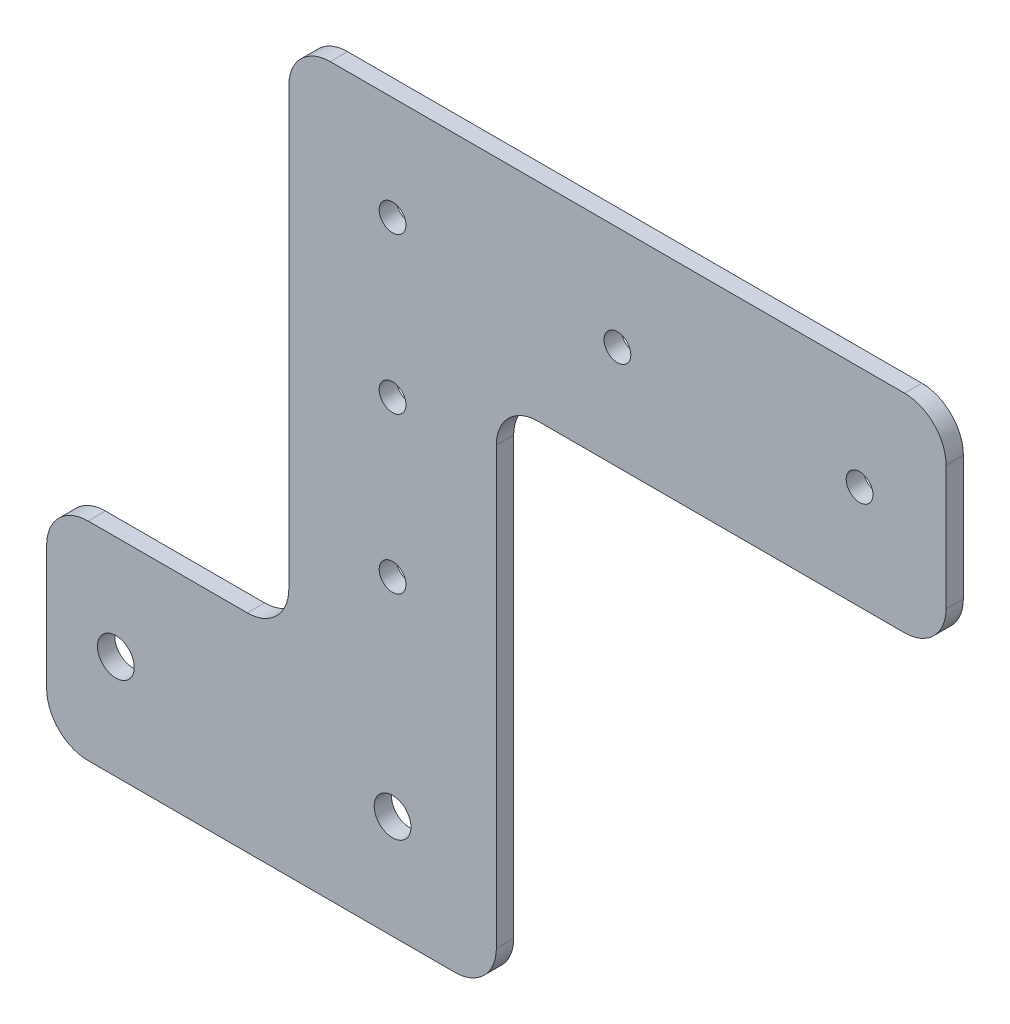
ISO-10303-21;
HEADER;
FILE_DESCRIPTION(('STEP AP214'),'2;1');
FILE_NAME('part.step','',(''),(''),'','','');
FILE_SCHEMA(('AUTOMOTIVE_DESIGN { 1 0 10303 214 1 1 1 1 }'));
ENDSEC;
DATA;
#1=APPLICATION_CONTEXT('core data for automotive mechanical design processes');
#2=APPLICATION_PROTOCOL_DEFINITION('international standard','automotive_design',2000,#1);
#3=PRODUCT_CONTEXT('',#1,'mechanical');
#4=PRODUCT('Part','Part','',(#3));
#5=PRODUCT_RELATED_PRODUCT_CATEGORY('part','',(#4));
#6=PRODUCT_DEFINITION_FORMATION('','',#4);
#7=PRODUCT_DEFINITION_CONTEXT('part definition',#1,'design');
#8=PRODUCT_DEFINITION('design','',#6,#7);
#9=PRODUCT_DEFINITION_SHAPE('','',#8);
#10=(LENGTH_UNIT() NAMED_UNIT(*) SI_UNIT(.MILLI.,.METRE.));
#11=(NAMED_UNIT(*) PLANE_ANGLE_UNIT() SI_UNIT($,.RADIAN.));
#12=(NAMED_UNIT(*) SI_UNIT($,.STERADIAN.) SOLID_ANGLE_UNIT());
#13=UNCERTAINTY_MEASURE_WITH_UNIT(LENGTH_MEASURE(1.E-05),#10,'distance_accuracy_value','');
#14=(GEOMETRIC_REPRESENTATION_CONTEXT(3) GLOBAL_UNCERTAINTY_ASSIGNED_CONTEXT((#13)) GLOBAL_UNIT_ASSIGNED_CONTEXT((#10,
#11,#12)) REPRESENTATION_CONTEXT('',''));
#15=CARTESIAN_POINT('',(0.,0.,0.));
#16=DIRECTION('',(0.,0.,1.));
#17=DIRECTION('',(1.,0.,0.));
#18=AXIS2_PLACEMENT_3D('',#15,#16,#17);
#19=CARTESIAN_POINT('',(0.,38.1,3.175));
#20=DIRECTION('',(1.,0.,0.));
#21=DIRECTION('',(0.,0.,-1.));
#22=AXIS2_PLACEMENT_3D('',#19,#20,#21);
#23=PLANE('',#22);
#24=DIRECTION('',(0.,-1.,0.));
#25=VECTOR('',#24,1.);
#26=CARTESIAN_POINT('',(0.,38.1,3.175));
#27=LINE('',#26,#25);
#28=CARTESIAN_POINT('',(0.,30.48,3.175));
#29=VERTEX_POINT('',#28);
#30=CARTESIAN_POINT('',(0.,7.62000000000002,3.175));
#31=VERTEX_POINT('',#30);
#32=EDGE_CURVE('E171',#29,#31,#27,.T.);
#33=ORIENTED_EDGE('',*,*,#32,.F.);
#34=DIRECTION('',(0.,0.,-1.));
#35=VECTOR('',#34,1.);
#36=CARTESIAN_POINT('',(0.,30.48,3.175));
#37=LINE('',#36,#35);
#38=CARTESIAN_POINT('',(0.,30.48,0.));
#39=VERTEX_POINT('',#38);
#40=EDGE_CURVE('E155',#29,#39,#37,.T.);
#41=ORIENTED_EDGE('',*,*,#40,.T.);
#42=DIRECTION('',(0.,-1.,0.));
#43=VECTOR('',#42,1.);
#44=CARTESIAN_POINT('',(0.,38.1,0.));
#45=LINE('',#44,#43);
#46=CARTESIAN_POINT('',(0.,7.62000000000002,0.));
#47=VERTEX_POINT('',#46);
#48=EDGE_CURVE('E168',#39,#47,#45,.T.);
#49=ORIENTED_EDGE('',*,*,#48,.T.);
#50=DIRECTION('',(0.,0.,-1.));
#51=VECTOR('',#50,1.);
#52=CARTESIAN_POINT('',(0.,7.61999999999999,3.175));
#53=LINE('',#52,#51);
#54=EDGE_CURVE('E174',#47,#31,#53,.F.);
#55=ORIENTED_EDGE('',*,*,#54,.T.);
#56=EDGE_LOOP('',(#33,#41,#49,#55));
#57=FACE_BOUND('',#56,.T.);
#58=ADVANCED_FACE('F36',(#57),#23,.F.);
#59=CARTESIAN_POINT('',(0.,0.,3.175));
#60=DIRECTION('',(0.,1.,0.));
#61=DIRECTION('',(0.,0.,1.));
#62=AXIS2_PLACEMENT_3D('',#59,#60,#61);
#63=PLANE('',#62);
#64=DIRECTION('',(1.,0.,0.));
#65=VECTOR('',#64,1.);
#66=CARTESIAN_POINT('',(0.,0.,0.));
#67=LINE('',#66,#65);
#68=CARTESIAN_POINT('',(7.61999999999999,0.,0.));
#69=VERTEX_POINT('',#68);
#70=CARTESIAN_POINT('',(74.93,0.,0.));
#71=VERTEX_POINT('',#70);
#72=EDGE_CURVE('E179',#69,#71,#67,.T.);
#73=ORIENTED_EDGE('',*,*,#72,.T.);
#74=DIRECTION('',(0.,0.,-1.));
#75=VECTOR('',#74,1.);
#76=CARTESIAN_POINT('',(74.93,0.,3.175));
#77=LINE('',#76,#75);
#78=CARTESIAN_POINT('',(74.93,0.,3.175));
#79=VERTEX_POINT('',#78);
#80=EDGE_CURVE('E291',#71,#79,#77,.F.);
#81=ORIENTED_EDGE('',*,*,#80,.T.);
#82=DIRECTION('',(1.,0.,0.));
#83=VECTOR('',#82,1.);
#84=CARTESIAN_POINT('',(0.,0.,3.175));
#85=LINE('',#84,#83);
#86=CARTESIAN_POINT('',(7.61999999999999,0.,3.175));
#87=VERTEX_POINT('',#86);
#88=EDGE_CURVE('E331',#87,#79,#85,.T.);
#89=ORIENTED_EDGE('',*,*,#88,.F.);
#90=DIRECTION('',(0.,0.,-1.));
#91=VECTOR('',#90,1.);
#92=CARTESIAN_POINT('',(7.61999999999999,0.,3.175));
#93=LINE('',#92,#91);
#94=EDGE_CURVE('E287',#87,#69,#93,.T.);
#95=ORIENTED_EDGE('',*,*,#94,.T.);
#96=EDGE_LOOP('',(#73,#81,#89,#95));
#97=FACE_BOUND('',#96,.T.);
#98=ADVANCED_FACE('F382',(#97),#63,.F.);
#99=CARTESIAN_POINT('',(82.55,0.,3.175));
#100=DIRECTION('',(-1.,0.,0.));
#101=DIRECTION('',(0.,0.,1.));
#102=AXIS2_PLACEMENT_3D('',#99,#100,#101);
#103=PLANE('',#102);
#104=DIRECTION('',(0.,1.,0.));
#105=VECTOR('',#104,1.);
#106=CARTESIAN_POINT('',(82.55,0.,3.175));
#107=LINE('',#106,#105);
#108=CARTESIAN_POINT('',(82.55,7.61999999999999,3.175));
#109=VERTEX_POINT('',#108);
#110=CARTESIAN_POINT('',(82.55,87.63,3.175));
#111=VERTEX_POINT('',#110);
#112=EDGE_CURVE('E318',#109,#111,#107,.T.);
#113=ORIENTED_EDGE('',*,*,#112,.F.);
#114=DIRECTION('',(0.,0.,-1.));
#115=VECTOR('',#114,1.);
#116=CARTESIAN_POINT('',(82.55,7.61999999999999,3.175));
#117=LINE('',#116,#115);
#118=CARTESIAN_POINT('',(82.55,7.61999999999999,0.));
#119=VERTEX_POINT('',#118);
#120=EDGE_CURVE('E283',#109,#119,#117,.T.);
#121=ORIENTED_EDGE('',*,*,#120,.T.);
#122=DIRECTION('',(0.,1.,0.));
#123=VECTOR('',#122,1.);
#124=CARTESIAN_POINT('',(82.55,0.,0.));
#125=LINE('',#124,#123);
#126=CARTESIAN_POINT('',(82.55,87.63,0.));
#127=VERTEX_POINT('',#126);
#128=EDGE_CURVE('E186',#119,#127,#125,.T.);
#129=ORIENTED_EDGE('',*,*,#128,.T.);
#130=DIRECTION('',(0.,0.,-1.));
#131=VECTOR('',#130,1.);
#132=CARTESIAN_POINT('',(82.55,87.63,3.175));
#133=LINE('',#132,#131);
#134=EDGE_CURVE('E280',#127,#111,#133,.F.);
#135=ORIENTED_EDGE('',*,*,#134,.T.);
#136=EDGE_LOOP('',(#113,#121,#129,#135));
#137=FACE_BOUND('',#136,.T.);
#138=ADVANCED_FACE('F308',(#137),#103,.F.);
#139=CARTESIAN_POINT('',(82.55,95.25,3.175));
#140=DIRECTION('',(0.,1.,0.));
#141=DIRECTION('',(0.,0.,1.));
#142=AXIS2_PLACEMENT_3D('',#139,#140,#141);
#143=PLANE('',#142);
#144=DIRECTION('',(1.,0.,0.));
#145=VECTOR('',#144,1.);
#146=CARTESIAN_POINT('',(82.55,95.25,0.));
#147=LINE('',#146,#145);
#148=CARTESIAN_POINT('',(90.17,95.25,0.));
#149=VERTEX_POINT('',#148);
#150=CARTESIAN_POINT('',(157.48,95.25,0.));
#151=VERTEX_POINT('',#150);
#152=EDGE_CURVE('E198',#149,#151,#147,.T.);
#153=ORIENTED_EDGE('',*,*,#152,.T.);
#154=DIRECTION('',(0.,0.,-1.));
#155=VECTOR('',#154,1.);
#156=CARTESIAN_POINT('',(157.48,95.25,3.175));
#157=LINE('',#156,#155);
#158=CARTESIAN_POINT('',(157.48,95.25,3.175));
#159=VERTEX_POINT('',#158);
#160=EDGE_CURVE('E277',#151,#159,#157,.F.);
#161=ORIENTED_EDGE('',*,*,#160,.T.);
#162=DIRECTION('',(1.,0.,0.));
#163=VECTOR('',#162,1.);
#164=CARTESIAN_POINT('',(82.55,95.25,3.175));
#165=LINE('',#164,#163);
#166=CARTESIAN_POINT('',(90.17,95.25,3.175));
#167=VERTEX_POINT('',#166);
#168=EDGE_CURVE('E316',#167,#159,#165,.T.);
#169=ORIENTED_EDGE('',*,*,#168,.F.);
#170=DIRECTION('',(0.,0.,-1.));
#171=VECTOR('',#170,1.);
#172=CARTESIAN_POINT('',(90.17,95.25,0.));
#173=LINE('',#172,#171);
#174=EDGE_CURVE('E273',#167,#149,#173,.T.);
#175=ORIENTED_EDGE('',*,*,#174,.T.);
#176=EDGE_LOOP('',(#153,#161,#169,#175));
#177=FACE_BOUND('',#176,.T.);
#178=ADVANCED_FACE('F320',(#177),#143,.F.);
#179=CARTESIAN_POINT('',(165.1,95.25,3.175));
#180=DIRECTION('',(-1.,0.,0.));
#181=DIRECTION('',(0.,0.,1.));
#182=AXIS2_PLACEMENT_3D('',#179,#180,#181);
#183=PLANE('',#182);
#184=DIRECTION('',(0.,1.,0.));
#185=VECTOR('',#184,1.);
#186=CARTESIAN_POINT('',(165.1,95.25,0.));
#187=LINE('',#186,#185);
#188=CARTESIAN_POINT('',(165.1,102.87,0.));
#189=VERTEX_POINT('',#188);
#190=CARTESIAN_POINT('',(165.1,125.73,0.));
#191=VERTEX_POINT('',#190);
#192=EDGE_CURVE('E202',#189,#191,#187,.T.);
#193=ORIENTED_EDGE('',*,*,#192,.T.);
#194=DIRECTION('',(0.,0.,-1.));
#195=VECTOR('',#194,1.);
#196=CARTESIAN_POINT('',(165.1,125.73,3.175));
#197=LINE('',#196,#195);
#198=CARTESIAN_POINT('',(165.1,125.73,3.175));
#199=VERTEX_POINT('',#198);
#200=EDGE_CURVE('E270',#191,#199,#197,.F.);
#201=ORIENTED_EDGE('',*,*,#200,.T.);
#202=DIRECTION('',(0.,1.,0.));
#203=VECTOR('',#202,1.);
#204=CARTESIAN_POINT('',(165.1,95.25,3.175));
#205=LINE('',#204,#203);
#206=CARTESIAN_POINT('',(165.1,102.87,3.175));
#207=VERTEX_POINT('',#206);
#208=EDGE_CURVE('E323',#207,#199,#205,.T.);
#209=ORIENTED_EDGE('',*,*,#208,.F.);
#210=DIRECTION('',(0.,0.,-1.));
#211=VECTOR('',#210,1.);
#212=CARTESIAN_POINT('',(165.1,102.87,3.175));
#213=LINE('',#212,#211);
#214=EDGE_CURVE('E266',#207,#189,#213,.T.);
#215=ORIENTED_EDGE('',*,*,#214,.T.);
#216=EDGE_LOOP('',(#193,#201,#209,#215));
#217=FACE_BOUND('',#216,.T.);
#218=ADVANCED_FACE('F365',(#217),#183,.F.);
#219=CARTESIAN_POINT('',(44.45,133.35,3.175));
#220=DIRECTION('',(0.,-1.,0.));
#221=DIRECTION('',(0.,0.,-1.));
#222=AXIS2_PLACEMENT_3D('',#219,#220,#221);
#223=PLANE('',#222);
#224=DIRECTION('',(-1.,0.,0.));
#225=VECTOR('',#224,1.);
#226=CARTESIAN_POINT('',(44.45,133.35,0.));
#227=LINE('',#226,#225);
#228=CARTESIAN_POINT('',(157.48,133.35,0.));
#229=VERTEX_POINT('',#228);
#230=CARTESIAN_POINT('',(52.07,133.35,0.));
#231=VERTEX_POINT('',#230);
#232=EDGE_CURVE('E206',#229,#231,#227,.T.);
#233=ORIENTED_EDGE('',*,*,#232,.T.);
#234=DIRECTION('',(0.,0.,-1.));
#235=VECTOR('',#234,1.);
#236=CARTESIAN_POINT('',(52.07,133.35,3.175));
#237=LINE('',#236,#235);
#238=CARTESIAN_POINT('',(52.07,133.35,3.175));
#239=VERTEX_POINT('',#238);
#240=EDGE_CURVE('E263',#231,#239,#237,.F.);
#241=ORIENTED_EDGE('',*,*,#240,.T.);
#242=DIRECTION('',(-1.,0.,0.));
#243=VECTOR('',#242,1.);
#244=CARTESIAN_POINT('',(44.45,133.35,3.175));
#245=LINE('',#244,#243);
#246=CARTESIAN_POINT('',(157.48,133.35,3.175));
#247=VERTEX_POINT('',#246);
#248=EDGE_CURVE('E329',#247,#239,#245,.T.);
#249=ORIENTED_EDGE('',*,*,#248,.F.);
#250=DIRECTION('',(0.,0.,-1.));
#251=VECTOR('',#250,1.);
#252=CARTESIAN_POINT('',(157.48,133.35,3.175));
#253=LINE('',#252,#251);
#254=EDGE_CURVE('E259',#247,#229,#253,.T.);
#255=ORIENTED_EDGE('',*,*,#254,.T.);
#256=EDGE_LOOP('',(#233,#241,#249,#255));
#257=FACE_BOUND('',#256,.T.);
#258=ADVANCED_FACE('F356',(#257),#223,.F.);
#259=CARTESIAN_POINT('',(44.45,38.1,3.175));
#260=DIRECTION('',(1.,0.,0.));
#261=DIRECTION('',(0.,0.,-1.));
#262=AXIS2_PLACEMENT_3D('',#259,#260,#261);
#263=PLANE('',#262);
#264=DIRECTION('',(0.,-1.,0.));
#265=VECTOR('',#264,1.);
#266=CARTESIAN_POINT('',(44.45,38.1,0.));
#267=LINE('',#266,#265);
#268=CARTESIAN_POINT('',(44.45,125.73,0.));
#269=VERTEX_POINT('',#268);
#270=CARTESIAN_POINT('',(44.45,45.72,0.));
#271=VERTEX_POINT('',#270);
#272=EDGE_CURVE('E210',#269,#271,#267,.T.);
#273=ORIENTED_EDGE('',*,*,#272,.T.);
#274=DIRECTION('',(0.,0.,-1.));
#275=VECTOR('',#274,1.);
#276=CARTESIAN_POINT('',(44.45,45.72,3.175));
#277=LINE('',#276,#275);
#278=CARTESIAN_POINT('',(44.45,45.72,3.175));
#279=VERTEX_POINT('',#278);
#280=EDGE_CURVE('E52',#271,#279,#277,.F.);
#281=ORIENTED_EDGE('',*,*,#280,.T.);
#282=DIRECTION('',(0.,-1.,0.));
#283=VECTOR('',#282,1.);
#284=CARTESIAN_POINT('',(44.45,38.1,3.175));
#285=LINE('',#284,#283);
#286=CARTESIAN_POINT('',(44.45,125.73,3.175));
#287=VERTEX_POINT('',#286);
#288=EDGE_CURVE('E336',#287,#279,#285,.T.);
#289=ORIENTED_EDGE('',*,*,#288,.F.);
#290=DIRECTION('',(0.,0.,-1.));
#291=VECTOR('',#290,1.);
#292=CARTESIAN_POINT('',(44.45,125.73,3.175));
#293=LINE('',#292,#291);
#294=EDGE_CURVE('E253',#287,#269,#293,.T.);
#295=ORIENTED_EDGE('',*,*,#294,.T.);
#296=EDGE_LOOP('',(#273,#281,#289,#295));
#297=FACE_BOUND('',#296,.T.);
#298=ADVANCED_FACE('F349',(#297),#263,.F.);
#299=CARTESIAN_POINT('',(0.,38.1,3.175));
#300=DIRECTION('',(0.,-1.,0.));
#301=DIRECTION('',(0.,0.,-1.));
#302=AXIS2_PLACEMENT_3D('',#299,#300,#301);
#303=PLANE('',#302);
#304=DIRECTION('',(-1.,0.,0.));
#305=VECTOR('',#304,1.);
#306=CARTESIAN_POINT('',(0.,38.1,0.));
#307=LINE('',#306,#305);
#308=CARTESIAN_POINT('',(36.83,38.1,0.));
#309=VERTEX_POINT('',#308);
#310=CARTESIAN_POINT('',(7.61999999999999,38.1,0.));
#311=VERTEX_POINT('',#310);
#312=EDGE_CURVE('E213',#309,#311,#307,.T.);
#313=ORIENTED_EDGE('',*,*,#312,.T.);
#314=DIRECTION('',(0.,0.,-1.));
#315=VECTOR('',#314,1.);
#316=CARTESIAN_POINT('',(7.61999999999999,38.1,3.175));
#317=LINE('',#316,#315);
#318=CARTESIAN_POINT('',(7.61999999999999,38.1,3.175));
#319=VERTEX_POINT('',#318);
#320=EDGE_CURVE('E156',#311,#319,#317,.F.);
#321=ORIENTED_EDGE('',*,*,#320,.T.);
#322=DIRECTION('',(-1.,0.,0.));
#323=VECTOR('',#322,1.);
#324=CARTESIAN_POINT('',(0.,38.1,3.175));
#325=LINE('',#324,#323);
#326=CARTESIAN_POINT('',(36.83,38.1,3.175));
#327=VERTEX_POINT('',#326);
#328=EDGE_CURVE('E192',#327,#319,#325,.T.);
#329=ORIENTED_EDGE('',*,*,#328,.F.);
#330=DIRECTION('',(0.,0.,-1.));
#331=VECTOR('',#330,1.);
#332=CARTESIAN_POINT('',(36.83,38.1,0.));
#333=LINE('',#332,#331);
#334=EDGE_CURVE('E162',#327,#309,#333,.T.);
#335=ORIENTED_EDGE('',*,*,#334,.T.);
#336=EDGE_LOOP('',(#313,#321,#329,#335));
#337=FACE_BOUND('',#336,.T.);
#338=ADVANCED_FACE('F345',(#337),#303,.F.);
#339=CARTESIAN_POINT('',(0.,0.,3.175));
#340=DIRECTION('',(0.,0.,1.));
#341=DIRECTION('',(1.,0.,0.));
#342=AXIS2_PLACEMENT_3D('',#339,#340,#341);
#343=PLANE('',#342);
#344=CARTESIAN_POINT('',(12.7,19.05,3.175));
#345=DIRECTION('',(0.,0.,1.));
#346=DIRECTION('',(1.,0.,0.));
#347=AXIS2_PLACEMENT_3D('',#344,#345,#346);
#348=CIRCLE('',#347,3.3782);
#349=CARTESIAN_POINT('',(16.0782,19.05,3.175));
#350=VERTEX_POINT('',#349);
#351=EDGE_CURVE('E492',#350,#350,#348,.T.);
#352=ORIENTED_EDGE('',*,*,#351,.F.);
#353=EDGE_LOOP('',(#352));
#354=FACE_BOUND('',#353,.T.);
#355=CARTESIAN_POINT('',(63.5,19.05,3.175));
#356=DIRECTION('',(0.,0.,1.));
#357=DIRECTION('',(1.,0.,0.));
#358=AXIS2_PLACEMENT_3D('',#355,#356,#357);
#359=CIRCLE('',#358,3.3782);
#360=CARTESIAN_POINT('',(66.8782,19.05,3.175));
#361=VERTEX_POINT('',#360);
#362=EDGE_CURVE('E484',#361,#361,#359,.T.);
#363=ORIENTED_EDGE('',*,*,#362,.F.);
#364=EDGE_LOOP('',(#363));
#365=FACE_BOUND('',#364,.T.);
#366=CARTESIAN_POINT('',(63.5,57.15,3.175));
#367=DIRECTION('',(0.,0.,1.));
#368=DIRECTION('',(1.,0.,0.));
#369=AXIS2_PLACEMENT_3D('',#366,#367,#368);
#370=CIRCLE('',#369,2.45745);
#371=CARTESIAN_POINT('',(65.95745,57.15,3.175));
#372=VERTEX_POINT('',#371);
#373=EDGE_CURVE('E476',#372,#372,#370,.T.);
#374=ORIENTED_EDGE('',*,*,#373,.F.);
#375=EDGE_LOOP('',(#374));
#376=FACE_BOUND('',#375,.T.);
#377=CARTESIAN_POINT('',(63.5,114.3,3.175));
#378=DIRECTION('',(0.,0.,1.));
#379=DIRECTION('',(1.,0.,0.));
#380=AXIS2_PLACEMENT_3D('',#377,#378,#379);
#381=CIRCLE('',#380,2.45745);
#382=CARTESIAN_POINT('',(65.95745,114.3,3.175));
#383=VERTEX_POINT('',#382);
#384=EDGE_CURVE('E468',#383,#383,#381,.T.);
#385=ORIENTED_EDGE('',*,*,#384,.F.);
#386=EDGE_LOOP('',(#385));
#387=FACE_BOUND('',#386,.T.);
#388=CARTESIAN_POINT('',(149.225,114.3,3.175));
#389=DIRECTION('',(0.,0.,1.));
#390=DIRECTION('',(1.,0.,0.));
#391=AXIS2_PLACEMENT_3D('',#388,#389,#390);
#392=CIRCLE('',#391,2.45745);
#393=CARTESIAN_POINT('',(151.68245,114.3,3.175));
#394=VERTEX_POINT('',#393);
#395=EDGE_CURVE('E460',#394,#394,#392,.T.);
#396=ORIENTED_EDGE('',*,*,#395,.F.);
#397=EDGE_LOOP('',(#396));
#398=FACE_BOUND('',#397,.T.);
#399=CARTESIAN_POINT('',(104.775,114.3,3.175));
#400=DIRECTION('',(0.,0.,1.));
#401=DIRECTION('',(1.,0.,0.));
#402=AXIS2_PLACEMENT_3D('',#399,#400,#401);
#403=CIRCLE('',#402,2.45745);
#404=CARTESIAN_POINT('',(107.23245,114.3,3.175));
#405=VERTEX_POINT('',#404);
#406=EDGE_CURVE('E452',#405,#405,#403,.T.);
#407=ORIENTED_EDGE('',*,*,#406,.F.);
#408=EDGE_LOOP('',(#407));
#409=FACE_BOUND('',#408,.T.);
#410=CARTESIAN_POINT('',(63.5,85.725,3.175));
#411=DIRECTION('',(0.,0.,1.));
#412=DIRECTION('',(1.,0.,0.));
#413=AXIS2_PLACEMENT_3D('',#410,#411,#412);
#414=CIRCLE('',#413,2.45745);
#415=CARTESIAN_POINT('',(65.95745,85.725,3.175));
#416=VERTEX_POINT('',#415);
#417=EDGE_CURVE('E189',#416,#416,#414,.T.);
#418=ORIENTED_EDGE('',*,*,#417,.F.);
#419=EDGE_LOOP('',(#418));
#420=FACE_BOUND('',#419,.T.);
#421=ORIENTED_EDGE('',*,*,#328,.T.);
#422=CARTESIAN_POINT('',(7.61999999999999,30.48,3.175));
#423=DIRECTION('',(0.,0.,1.));
#424=DIRECTION('',(1.,0.,0.));
#425=AXIS2_PLACEMENT_3D('',#422,#423,#424);
#426=CIRCLE('',#425,7.62);
#427=EDGE_CURVE('E250',#319,#29,#426,.T.);
#428=ORIENTED_EDGE('',*,*,#427,.T.);
#429=ORIENTED_EDGE('',*,*,#32,.T.);
#430=CARTESIAN_POINT('',(7.61999999999999,7.61999999999999,3.175));
#431=DIRECTION('',(0.,0.,1.));
#432=DIRECTION('',(1.,0.,0.));
#433=AXIS2_PLACEMENT_3D('',#430,#431,#432);
#434=CIRCLE('',#433,7.62);
#435=EDGE_CURVE('E236',#31,#87,#434,.T.);
#436=ORIENTED_EDGE('',*,*,#435,.T.);
#437=ORIENTED_EDGE('',*,*,#88,.T.);
#438=CARTESIAN_POINT('',(74.93,7.61999999999999,3.175));
#439=DIRECTION('',(0.,0.,1.));
#440=DIRECTION('',(1.,0.,0.));
#441=AXIS2_PLACEMENT_3D('',#438,#439,#440);
#442=CIRCLE('',#441,7.62);
#443=EDGE_CURVE('E239',#79,#109,#442,.T.);
#444=ORIENTED_EDGE('',*,*,#443,.T.);
#445=ORIENTED_EDGE('',*,*,#112,.T.);
#446=CARTESIAN_POINT('',(90.17,87.63,3.175));
#447=DIRECTION('',(0.,0.,1.));
#448=DIRECTION('',(1.,0.,0.));
#449=AXIS2_PLACEMENT_3D('',#446,#447,#448);
#450=CIRCLE('',#449,7.62);
#451=EDGE_CURVE('E11',#111,#167,#450,.F.);
#452=ORIENTED_EDGE('',*,*,#451,.T.);
#453=ORIENTED_EDGE('',*,*,#168,.T.);
#454=CARTESIAN_POINT('',(157.48,102.87,3.175));
#455=DIRECTION('',(0.,0.,1.));
#456=DIRECTION('',(1.,0.,0.));
#457=AXIS2_PLACEMENT_3D('',#454,#455,#456);
#458=CIRCLE('',#457,7.62);
#459=EDGE_CURVE('E242',#159,#207,#458,.T.);
#460=ORIENTED_EDGE('',*,*,#459,.T.);
#461=ORIENTED_EDGE('',*,*,#208,.T.);
#462=CARTESIAN_POINT('',(157.48,125.73,3.175));
#463=DIRECTION('',(0.,0.,1.));
#464=DIRECTION('',(1.,0.,0.));
#465=AXIS2_PLACEMENT_3D('',#462,#463,#464);
#466=CIRCLE('',#465,7.62);
#467=EDGE_CURVE('E245',#199,#247,#466,.T.);
#468=ORIENTED_EDGE('',*,*,#467,.T.);
#469=ORIENTED_EDGE('',*,*,#248,.T.);
#470=CARTESIAN_POINT('',(52.07,125.73,3.175));
#471=DIRECTION('',(0.,0.,1.));
#472=DIRECTION('',(1.,0.,0.));
#473=AXIS2_PLACEMENT_3D('',#470,#471,#472);
#474=CIRCLE('',#473,7.62);
#475=EDGE_CURVE('E59',#239,#287,#474,.T.);
#476=ORIENTED_EDGE('',*,*,#475,.T.);
#477=ORIENTED_EDGE('',*,*,#288,.T.);
#478=CARTESIAN_POINT('',(36.83,45.72,3.175));
#479=DIRECTION('',(0.,0.,1.));
#480=DIRECTION('',(1.,0.,0.));
#481=AXIS2_PLACEMENT_3D('',#478,#479,#480);
#482=CIRCLE('',#481,7.62);
#483=EDGE_CURVE('E297',#279,#327,#482,.F.);
#484=ORIENTED_EDGE('',*,*,#483,.T.);
#485=EDGE_LOOP('',(#421,#428,#429,#436,#437,#444,#445,#452,#453,#460,#461,#468,#469,#476,#477,#484));
#486=FACE_BOUND('',#485,.T.);
#487=ADVANCED_FACE('F315',(#354,#365,#376,#387,#398,#409,#420,#486),#343,.T.);
#488=CARTESIAN_POINT('',(0.,0.,0.));
#489=DIRECTION('',(0.,0.,1.));
#490=DIRECTION('',(1.,0.,0.));
#491=AXIS2_PLACEMENT_3D('',#488,#489,#490);
#492=PLANE('',#491);
#493=CARTESIAN_POINT('',(12.7,19.05,0.));
#494=DIRECTION('',(0.,0.,1.));
#495=DIRECTION('',(1.,0.,0.));
#496=AXIS2_PLACEMENT_3D('',#493,#494,#495);
#497=CIRCLE('',#496,3.3782);
#498=CARTESIAN_POINT('',(16.0782,19.05,0.));
#499=VERTEX_POINT('',#498);
#500=EDGE_CURVE('E488',#499,#499,#497,.T.);
#501=ORIENTED_EDGE('',*,*,#500,.T.);
#502=EDGE_LOOP('',(#501));
#503=FACE_BOUND('',#502,.T.);
#504=CARTESIAN_POINT('',(63.5,19.05,0.));
#505=DIRECTION('',(0.,0.,1.));
#506=DIRECTION('',(1.,0.,0.));
#507=AXIS2_PLACEMENT_3D('',#504,#505,#506);
#508=CIRCLE('',#507,3.3782);
#509=CARTESIAN_POINT('',(66.8782,19.05,0.));
#510=VERTEX_POINT('',#509);
#511=EDGE_CURVE('E480',#510,#510,#508,.T.);
#512=ORIENTED_EDGE('',*,*,#511,.T.);
#513=EDGE_LOOP('',(#512));
#514=FACE_BOUND('',#513,.T.);
#515=CARTESIAN_POINT('',(63.5,57.15,0.));
#516=DIRECTION('',(0.,0.,1.));
#517=DIRECTION('',(1.,0.,0.));
#518=AXIS2_PLACEMENT_3D('',#515,#516,#517);
#519=CIRCLE('',#518,2.45745);
#520=CARTESIAN_POINT('',(65.95745,57.15,0.));
#521=VERTEX_POINT('',#520);
#522=EDGE_CURVE('E472',#521,#521,#519,.T.);
#523=ORIENTED_EDGE('',*,*,#522,.T.);
#524=EDGE_LOOP('',(#523));
#525=FACE_BOUND('',#524,.T.);
#526=CARTESIAN_POINT('',(63.5,114.3,0.));
#527=DIRECTION('',(0.,0.,1.));
#528=DIRECTION('',(1.,0.,0.));
#529=AXIS2_PLACEMENT_3D('',#526,#527,#528);
#530=CIRCLE('',#529,2.45745);
#531=CARTESIAN_POINT('',(65.95745,114.3,0.));
#532=VERTEX_POINT('',#531);
#533=EDGE_CURVE('E464',#532,#532,#530,.T.);
#534=ORIENTED_EDGE('',*,*,#533,.T.);
#535=EDGE_LOOP('',(#534));
#536=FACE_BOUND('',#535,.T.);
#537=CARTESIAN_POINT('',(149.225,114.3,0.));
#538=DIRECTION('',(0.,0.,1.));
#539=DIRECTION('',(1.,0.,0.));
#540=AXIS2_PLACEMENT_3D('',#537,#538,#539);
#541=CIRCLE('',#540,2.45745);
#542=CARTESIAN_POINT('',(151.68245,114.3,0.));
#543=VERTEX_POINT('',#542);
#544=EDGE_CURVE('E456',#543,#543,#541,.T.);
#545=ORIENTED_EDGE('',*,*,#544,.T.);
#546=EDGE_LOOP('',(#545));
#547=FACE_BOUND('',#546,.T.);
#548=CARTESIAN_POINT('',(104.775,114.3,0.));
#549=DIRECTION('',(0.,0.,1.));
#550=DIRECTION('',(1.,0.,0.));
#551=AXIS2_PLACEMENT_3D('',#548,#549,#550);
#552=CIRCLE('',#551,2.45745);
#553=CARTESIAN_POINT('',(107.23245,114.3,0.));
#554=VERTEX_POINT('',#553);
#555=EDGE_CURVE('E448',#554,#554,#552,.T.);
#556=ORIENTED_EDGE('',*,*,#555,.T.);
#557=EDGE_LOOP('',(#556));
#558=FACE_BOUND('',#557,.T.);
#559=CARTESIAN_POINT('',(63.5,85.725,0.));
#560=DIRECTION('',(0.,0.,1.));
#561=DIRECTION('',(1.,0.,0.));
#562=AXIS2_PLACEMENT_3D('',#559,#560,#561);
#563=CIRCLE('',#562,2.45745);
#564=CARTESIAN_POINT('',(65.95745,85.725,0.));
#565=VERTEX_POINT('',#564);
#566=EDGE_CURVE('E180',#565,#565,#563,.T.);
#567=ORIENTED_EDGE('',*,*,#566,.T.);
#568=EDGE_LOOP('',(#567));
#569=FACE_BOUND('',#568,.T.);
#570=ORIENTED_EDGE('',*,*,#48,.F.);
#571=CARTESIAN_POINT('',(7.61999999999999,30.48,0.));
#572=DIRECTION('',(0.,0.,1.));
#573=DIRECTION('',(1.,0.,0.));
#574=AXIS2_PLACEMENT_3D('',#571,#572,#573);
#575=CIRCLE('',#574,7.62);
#576=EDGE_CURVE('E151',#39,#311,#575,.F.);
#577=ORIENTED_EDGE('',*,*,#576,.T.);
#578=ORIENTED_EDGE('',*,*,#312,.F.);
#579=CARTESIAN_POINT('',(36.83,45.72,0.));
#580=DIRECTION('',(0.,0.,1.));
#581=DIRECTION('',(1.,0.,0.));
#582=AXIS2_PLACEMENT_3D('',#579,#580,#581);
#583=CIRCLE('',#582,7.62);
#584=EDGE_CURVE('E294',#309,#271,#583,.T.);
#585=ORIENTED_EDGE('',*,*,#584,.T.);
#586=ORIENTED_EDGE('',*,*,#272,.F.);
#587=CARTESIAN_POINT('',(52.07,125.73,0.));
#588=DIRECTION('',(0.,0.,1.));
#589=DIRECTION('',(1.,0.,0.));
#590=AXIS2_PLACEMENT_3D('',#587,#588,#589);
#591=CIRCLE('',#590,7.62);
#592=EDGE_CURVE('E163',#269,#231,#591,.F.);
#593=ORIENTED_EDGE('',*,*,#592,.T.);
#594=ORIENTED_EDGE('',*,*,#232,.F.);
#595=CARTESIAN_POINT('',(157.48,125.73,0.));
#596=DIRECTION('',(0.,0.,1.));
#597=DIRECTION('',(1.,0.,0.));
#598=AXIS2_PLACEMENT_3D('',#595,#596,#597);
#599=CIRCLE('',#598,7.62);
#600=EDGE_CURVE('E226',#229,#191,#599,.F.);
#601=ORIENTED_EDGE('',*,*,#600,.T.);
#602=ORIENTED_EDGE('',*,*,#192,.F.);
#603=CARTESIAN_POINT('',(157.48,102.87,0.));
#604=DIRECTION('',(0.,0.,1.));
#605=DIRECTION('',(1.,0.,0.));
#606=AXIS2_PLACEMENT_3D('',#603,#604,#605);
#607=CIRCLE('',#606,7.62);
#608=EDGE_CURVE('E223',#189,#151,#607,.F.);
#609=ORIENTED_EDGE('',*,*,#608,.T.);
#610=ORIENTED_EDGE('',*,*,#152,.F.);
#611=CARTESIAN_POINT('',(90.17,87.63,0.));
#612=DIRECTION('',(0.,0.,1.));
#613=DIRECTION('',(1.,0.,0.));
#614=AXIS2_PLACEMENT_3D('',#611,#612,#613);
#615=CIRCLE('',#614,7.62);
#616=EDGE_CURVE('E45',#149,#127,#615,.T.);
#617=ORIENTED_EDGE('',*,*,#616,.T.);
#618=ORIENTED_EDGE('',*,*,#128,.F.);
#619=CARTESIAN_POINT('',(74.93,7.61999999999999,0.));
#620=DIRECTION('',(0.,0.,1.));
#621=DIRECTION('',(1.,0.,0.));
#622=AXIS2_PLACEMENT_3D('',#619,#620,#621);
#623=CIRCLE('',#622,7.62);
#624=EDGE_CURVE('E220',#119,#71,#623,.F.);
#625=ORIENTED_EDGE('',*,*,#624,.T.);
#626=ORIENTED_EDGE('',*,*,#72,.F.);
#627=CARTESIAN_POINT('',(7.61999999999999,7.61999999999999,0.));
#628=DIRECTION('',(0.,0.,1.));
#629=DIRECTION('',(1.,0.,0.));
#630=AXIS2_PLACEMENT_3D('',#627,#628,#629);
#631=CIRCLE('',#630,7.62);
#632=EDGE_CURVE('E173',#69,#47,#631,.F.);
#633=ORIENTED_EDGE('',*,*,#632,.T.);
#634=EDGE_LOOP('',(#570,#577,#578,#585,#586,#593,#594,#601,#602,#609,#610,#617,#618,#625,#626,#633));
#635=FACE_BOUND('',#634,.T.);
#636=ADVANCED_FACE('F176',(#503,#514,#525,#536,#547,#558,#569,#635),#492,.F.);
#637=CARTESIAN_POINT('',(63.5,85.725,3.175));
#638=DIRECTION('',(0.,0.,1.));
#639=DIRECTION('',(1.,0.,0.));
#640=AXIS2_PLACEMENT_3D('',#637,#638,#639);
#641=CYLINDRICAL_SURFACE('',#640,2.45745);
#642=ORIENTED_EDGE('',*,*,#566,.F.);
#643=EDGE_LOOP('',(#642));
#644=FACE_BOUND('',#643,.T.);
#645=ORIENTED_EDGE('',*,*,#417,.T.);
#646=EDGE_LOOP('',(#645));
#647=FACE_BOUND('',#646,.T.);
#648=ADVANCED_FACE('F514',(#644,#647),#641,.F.);
#649=CARTESIAN_POINT('',(104.775,114.3,3.175));
#650=DIRECTION('',(0.,0.,1.));
#651=DIRECTION('',(1.,0.,0.));
#652=AXIS2_PLACEMENT_3D('',#649,#650,#651);
#653=CYLINDRICAL_SURFACE('',#652,2.45745);
#654=ORIENTED_EDGE('',*,*,#555,.F.);
#655=EDGE_LOOP('',(#654));
#656=FACE_BOUND('',#655,.T.);
#657=ORIENTED_EDGE('',*,*,#406,.T.);
#658=EDGE_LOOP('',(#657));
#659=FACE_BOUND('',#658,.T.);
#660=ADVANCED_FACE('F516',(#656,#659),#653,.F.);
#661=CARTESIAN_POINT('',(149.225,114.3,3.175));
#662=DIRECTION('',(0.,0.,1.));
#663=DIRECTION('',(1.,0.,0.));
#664=AXIS2_PLACEMENT_3D('',#661,#662,#663);
#665=CYLINDRICAL_SURFACE('',#664,2.45745);
#666=ORIENTED_EDGE('',*,*,#544,.F.);
#667=EDGE_LOOP('',(#666));
#668=FACE_BOUND('',#667,.T.);
#669=ORIENTED_EDGE('',*,*,#395,.T.);
#670=EDGE_LOOP('',(#669));
#671=FACE_BOUND('',#670,.T.);
#672=ADVANCED_FACE('F523',(#668,#671),#665,.F.);
#673=CARTESIAN_POINT('',(63.5,114.3,3.175));
#674=DIRECTION('',(0.,0.,1.));
#675=DIRECTION('',(1.,0.,0.));
#676=AXIS2_PLACEMENT_3D('',#673,#674,#675);
#677=CYLINDRICAL_SURFACE('',#676,2.45745);
#678=ORIENTED_EDGE('',*,*,#533,.F.);
#679=EDGE_LOOP('',(#678));
#680=FACE_BOUND('',#679,.T.);
#681=ORIENTED_EDGE('',*,*,#384,.T.);
#682=EDGE_LOOP('',(#681));
#683=FACE_BOUND('',#682,.T.);
#684=ADVANCED_FACE('F592',(#680,#683),#677,.F.);
#685=CARTESIAN_POINT('',(63.5,57.15,3.175));
#686=DIRECTION('',(0.,0.,1.));
#687=DIRECTION('',(1.,0.,0.));
#688=AXIS2_PLACEMENT_3D('',#685,#686,#687);
#689=CYLINDRICAL_SURFACE('',#688,2.45745);
#690=ORIENTED_EDGE('',*,*,#522,.F.);
#691=EDGE_LOOP('',(#690));
#692=FACE_BOUND('',#691,.T.);
#693=ORIENTED_EDGE('',*,*,#373,.T.);
#694=EDGE_LOOP('',(#693));
#695=FACE_BOUND('',#694,.T.);
#696=ADVANCED_FACE('F601',(#692,#695),#689,.F.);
#697=CARTESIAN_POINT('',(63.5,19.05,3.175));
#698=DIRECTION('',(0.,0.,1.));
#699=DIRECTION('',(1.,0.,0.));
#700=AXIS2_PLACEMENT_3D('',#697,#698,#699);
#701=CYLINDRICAL_SURFACE('',#700,3.3782);
#702=ORIENTED_EDGE('',*,*,#511,.F.);
#703=EDGE_LOOP('',(#702));
#704=FACE_BOUND('',#703,.T.);
#705=ORIENTED_EDGE('',*,*,#362,.T.);
#706=EDGE_LOOP('',(#705));
#707=FACE_BOUND('',#706,.T.);
#708=ADVANCED_FACE('F611',(#704,#707),#701,.F.);
#709=CARTESIAN_POINT('',(12.7,19.05,3.175));
#710=DIRECTION('',(0.,0.,1.));
#711=DIRECTION('',(1.,0.,0.));
#712=AXIS2_PLACEMENT_3D('',#709,#710,#711);
#713=CYLINDRICAL_SURFACE('',#712,3.3782);
#714=ORIENTED_EDGE('',*,*,#500,.F.);
#715=EDGE_LOOP('',(#714));
#716=FACE_BOUND('',#715,.T.);
#717=ORIENTED_EDGE('',*,*,#351,.T.);
#718=EDGE_LOOP('',(#717));
#719=FACE_BOUND('',#718,.T.);
#720=ADVANCED_FACE('F393',(#716,#719),#713,.F.);
#721=CARTESIAN_POINT('',(7.61999999999999,30.48,3.175));
#722=DIRECTION('',(0.,0.,-1.));
#723=DIRECTION('',(-1.,0.,0.));
#724=AXIS2_PLACEMENT_3D('',#721,#722,#723);
#725=CYLINDRICAL_SURFACE('',#724,7.62);
#726=ORIENTED_EDGE('',*,*,#427,.F.);
#727=ORIENTED_EDGE('',*,*,#320,.F.);
#728=ORIENTED_EDGE('',*,*,#576,.F.);
#729=ORIENTED_EDGE('',*,*,#40,.F.);
#730=EDGE_LOOP('',(#726,#727,#728,#729));
#731=FACE_BOUND('',#730,.T.);
#732=ADVANCED_FACE('F154',(#731),#725,.T.);
#733=CARTESIAN_POINT('',(36.83,45.72,3.175));
#734=DIRECTION('',(0.,0.,1.));
#735=DIRECTION('',(1.,0.,0.));
#736=AXIS2_PLACEMENT_3D('',#733,#734,#735);
#737=CYLINDRICAL_SURFACE('',#736,7.62);
#738=ORIENTED_EDGE('',*,*,#483,.F.);
#739=ORIENTED_EDGE('',*,*,#280,.F.);
#740=ORIENTED_EDGE('',*,*,#584,.F.);
#741=ORIENTED_EDGE('',*,*,#334,.F.);
#742=EDGE_LOOP('',(#738,#739,#740,#741));
#743=FACE_BOUND('',#742,.T.);
#744=ADVANCED_FACE('F347',(#743),#737,.F.);
#745=CARTESIAN_POINT('',(52.07,125.73,3.175));
#746=DIRECTION('',(0.,0.,-1.));
#747=DIRECTION('',(-1.,0.,0.));
#748=AXIS2_PLACEMENT_3D('',#745,#746,#747);
#749=CYLINDRICAL_SURFACE('',#748,7.62);
#750=ORIENTED_EDGE('',*,*,#475,.F.);
#751=ORIENTED_EDGE('',*,*,#240,.F.);
#752=ORIENTED_EDGE('',*,*,#592,.F.);
#753=ORIENTED_EDGE('',*,*,#294,.F.);
#754=EDGE_LOOP('',(#750,#751,#752,#753));
#755=FACE_BOUND('',#754,.T.);
#756=ADVANCED_FACE('F352',(#755),#749,.T.);
#757=CARTESIAN_POINT('',(157.48,125.73,3.175));
#758=DIRECTION('',(0.,0.,-1.));
#759=DIRECTION('',(-1.,0.,0.));
#760=AXIS2_PLACEMENT_3D('',#757,#758,#759);
#761=CYLINDRICAL_SURFACE('',#760,7.62);
#762=ORIENTED_EDGE('',*,*,#467,.F.);
#763=ORIENTED_EDGE('',*,*,#200,.F.);
#764=ORIENTED_EDGE('',*,*,#600,.F.);
#765=ORIENTED_EDGE('',*,*,#254,.F.);
#766=EDGE_LOOP('',(#762,#763,#764,#765));
#767=FACE_BOUND('',#766,.T.);
#768=ADVANCED_FACE('F361',(#767),#761,.T.);
#769=CARTESIAN_POINT('',(157.48,102.87,3.175));
#770=DIRECTION('',(0.,0.,-1.));
#771=DIRECTION('',(-1.,0.,0.));
#772=AXIS2_PLACEMENT_3D('',#769,#770,#771);
#773=CYLINDRICAL_SURFACE('',#772,7.62);
#774=ORIENTED_EDGE('',*,*,#459,.F.);
#775=ORIENTED_EDGE('',*,*,#160,.F.);
#776=ORIENTED_EDGE('',*,*,#608,.F.);
#777=ORIENTED_EDGE('',*,*,#214,.F.);
#778=EDGE_LOOP('',(#774,#775,#776,#777));
#779=FACE_BOUND('',#778,.T.);
#780=ADVANCED_FACE('F369',(#779),#773,.T.);
#781=CARTESIAN_POINT('',(74.93,7.61999999999999,3.175));
#782=DIRECTION('',(0.,0.,-1.));
#783=DIRECTION('',(-1.,0.,0.));
#784=AXIS2_PLACEMENT_3D('',#781,#782,#783);
#785=CYLINDRICAL_SURFACE('',#784,7.62);
#786=ORIENTED_EDGE('',*,*,#443,.F.);
#787=ORIENTED_EDGE('',*,*,#80,.F.);
#788=ORIENTED_EDGE('',*,*,#624,.F.);
#789=ORIENTED_EDGE('',*,*,#120,.F.);
#790=EDGE_LOOP('',(#786,#787,#788,#789));
#791=FACE_BOUND('',#790,.T.);
#792=ADVANCED_FACE('F371',(#791),#785,.T.);
#793=CARTESIAN_POINT('',(7.61999999999999,7.61999999999999,3.175));
#794=DIRECTION('',(0.,0.,-1.));
#795=DIRECTION('',(-1.,0.,0.));
#796=AXIS2_PLACEMENT_3D('',#793,#794,#795);
#797=CYLINDRICAL_SURFACE('',#796,7.62);
#798=ORIENTED_EDGE('',*,*,#435,.F.);
#799=ORIENTED_EDGE('',*,*,#54,.F.);
#800=ORIENTED_EDGE('',*,*,#632,.F.);
#801=ORIENTED_EDGE('',*,*,#94,.F.);
#802=EDGE_LOOP('',(#798,#799,#800,#801));
#803=FACE_BOUND('',#802,.T.);
#804=ADVANCED_FACE('F377',(#803),#797,.T.);
#805=CARTESIAN_POINT('',(90.17,87.63,3.175));
#806=DIRECTION('',(0.,0.,1.));
#807=DIRECTION('',(1.,0.,0.));
#808=AXIS2_PLACEMENT_3D('',#805,#806,#807);
#809=CYLINDRICAL_SURFACE('',#808,7.62);
#810=ORIENTED_EDGE('',*,*,#451,.F.);
#811=ORIENTED_EDGE('',*,*,#134,.F.);
#812=ORIENTED_EDGE('',*,*,#616,.F.);
#813=ORIENTED_EDGE('',*,*,#174,.F.);
#814=EDGE_LOOP('',(#810,#811,#812,#813));
#815=FACE_BOUND('',#814,.T.);
#816=ADVANCED_FACE('F38',(#815),#809,.F.);
#817=CLOSED_SHELL('',(#58,#98,#138,#178,#218,#258,#298,#338,#487,#636,#648,#660,#672,#684,#696,
#708,#720,#732,#744,#756,#768,#780,#792,#804,#816));
#818=MANIFOLD_SOLID_BREP('B2',#817);
#819=ADVANCED_BREP_SHAPE_REPRESENTATION('',(#18,#818),#14);
#820=SHAPE_DEFINITION_REPRESENTATION(#9,#819);
ENDSEC;
END-ISO-10303-21;
